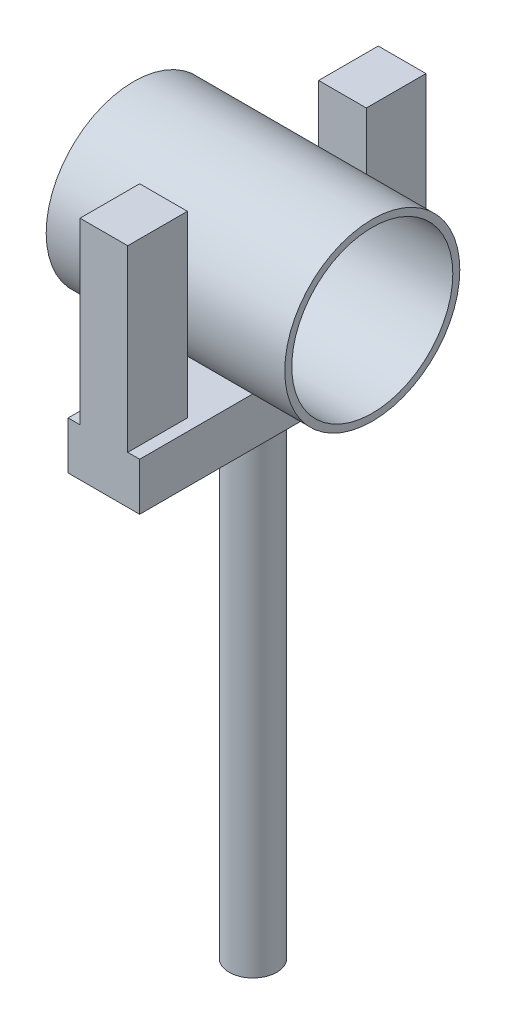
ISO-10303-21;
HEADER;
FILE_DESCRIPTION(('STEP AP214'),'2;1');
FILE_NAME('part.step','',(''),(''),'','','');
FILE_SCHEMA(('AUTOMOTIVE_DESIGN { 1 0 10303 214 1 1 1 1 }'));
ENDSEC;
DATA;
#1=APPLICATION_CONTEXT('core data for automotive mechanical design processes');
#2=APPLICATION_PROTOCOL_DEFINITION('international standard','automotive_design',2000,#1);
#3=PRODUCT_CONTEXT('',#1,'mechanical');
#4=PRODUCT('Part','Part','',(#3));
#5=PRODUCT_RELATED_PRODUCT_CATEGORY('part','',(#4));
#6=PRODUCT_DEFINITION_FORMATION('','',#4);
#7=PRODUCT_DEFINITION_CONTEXT('part definition',#1,'design');
#8=PRODUCT_DEFINITION('design','',#6,#7);
#9=PRODUCT_DEFINITION_SHAPE('','',#8);
#10=(LENGTH_UNIT() NAMED_UNIT(*) SI_UNIT(.MILLI.,.METRE.));
#11=(NAMED_UNIT(*) PLANE_ANGLE_UNIT() SI_UNIT($,.RADIAN.));
#12=(NAMED_UNIT(*) SI_UNIT($,.STERADIAN.) SOLID_ANGLE_UNIT());
#13=UNCERTAINTY_MEASURE_WITH_UNIT(LENGTH_MEASURE(1.E-05),#10,'distance_accuracy_value','');
#14=(GEOMETRIC_REPRESENTATION_CONTEXT(3) GLOBAL_UNCERTAINTY_ASSIGNED_CONTEXT((#13)) GLOBAL_UNIT_ASSIGNED_CONTEXT((#10,
#11,#12)) REPRESENTATION_CONTEXT('',''));
#15=CARTESIAN_POINT('',(0.,0.,0.));
#16=DIRECTION('',(0.,0.,1.));
#17=DIRECTION('',(1.,0.,0.));
#18=AXIS2_PLACEMENT_3D('',#15,#16,#17);
#19=CARTESIAN_POINT('',(-50.,256.687155129039,0.));
#20=DIRECTION('',(1.,0.,0.));
#21=DIRECTION('',(0.,0.,-1.));
#22=AXIS2_PLACEMENT_3D('',#19,#20,#21);
#23=CYLINDRICAL_SURFACE('',#22,36.687155129039);
#24=CARTESIAN_POINT('',(-50.,256.687155129039,0.));
#25=DIRECTION('',(1.,0.,0.));
#26=DIRECTION('',(0.,0.,-1.));
#27=AXIS2_PLACEMENT_3D('',#24,#25,#26);
#28=CIRCLE('',#27,36.687155129039);
#29=CARTESIAN_POINT('',(-50.,256.687155129039,-36.687155129039));
#30=VERTEX_POINT('',#29);
#31=EDGE_CURVE('E11',#30,#30,#28,.T.);
#32=ORIENTED_EDGE('',*,*,#31,.T.);
#33=EDGE_LOOP('',(#32));
#34=FACE_BOUND('',#33,.T.);
#35=CARTESIAN_POINT('',(50.,256.687155129039,0.));
#36=DIRECTION('',(1.,0.,0.));
#37=DIRECTION('',(0.,0.,-1.));
#38=AXIS2_PLACEMENT_3D('',#35,#36,#37);
#39=CIRCLE('',#38,36.687155129039);
#40=CARTESIAN_POINT('',(50.,256.687155129039,-36.687155129039));
#41=VERTEX_POINT('',#40);
#42=EDGE_CURVE('E50',#41,#41,#39,.T.);
#43=ORIENTED_EDGE('',*,*,#42,.F.);
#44=EDGE_LOOP('',(#43));
#45=FACE_BOUND('',#44,.T.);
#46=ADVANCED_FACE('F44',(#34,#45),#23,.T.);
#47=CARTESIAN_POINT('',(-50.,256.687155129039,0.));
#48=DIRECTION('',(1.,0.,0.));
#49=DIRECTION('',(0.,0.,-1.));
#50=AXIS2_PLACEMENT_3D('',#47,#48,#49);
#51=PLANE('',#50);
#52=ORIENTED_EDGE('',*,*,#31,.F.);
#53=EDGE_LOOP('',(#52));
#54=FACE_BOUND('',#53,.T.);
#55=ADVANCED_FACE('F68',(#54),#51,.F.);
#56=CARTESIAN_POINT('',(50.,256.687155129039,0.));
#57=DIRECTION('',(1.,0.,0.));
#58=DIRECTION('',(0.,0.,-1.));
#59=AXIS2_PLACEMENT_3D('',#56,#57,#58);
#60=PLANE('',#59);
#61=CARTESIAN_POINT('',(50.,256.687155129039,0.));
#62=DIRECTION('',(1.,0.,0.));
#63=DIRECTION('',(0.,0.,-1.));
#64=AXIS2_PLACEMENT_3D('',#61,#62,#63);
#65=CIRCLE('',#64,33.75);
#66=CARTESIAN_POINT('',(50.,256.687155129039,-33.75));
#67=VERTEX_POINT('',#66);
#68=EDGE_CURVE('E58',#67,#67,#65,.T.);
#69=ORIENTED_EDGE('',*,*,#68,.F.);
#70=EDGE_LOOP('',(#69));
#71=FACE_BOUND('',#70,.T.);
#72=ORIENTED_EDGE('',*,*,#42,.T.);
#73=EDGE_LOOP('',(#72));
#74=FACE_BOUND('',#73,.T.);
#75=ADVANCED_FACE('F66',(#71,#74),#60,.T.);
#76=CARTESIAN_POINT('',(-45.,256.687155129039,0.));
#77=DIRECTION('',(1.,0.,0.));
#78=DIRECTION('',(0.,0.,-1.));
#79=AXIS2_PLACEMENT_3D('',#76,#77,#78);
#80=CYLINDRICAL_SURFACE('',#79,33.75);
#81=CARTESIAN_POINT('',(-45.,256.687155129039,0.));
#82=DIRECTION('',(1.,0.,0.));
#83=DIRECTION('',(0.,0.,-1.));
#84=AXIS2_PLACEMENT_3D('',#81,#82,#83);
#85=CIRCLE('',#84,33.75);
#86=CARTESIAN_POINT('',(-45.,256.687155129039,-33.75));
#87=VERTEX_POINT('',#86);
#88=EDGE_CURVE('E54',#87,#87,#85,.T.);
#89=ORIENTED_EDGE('',*,*,#88,.F.);
#90=EDGE_LOOP('',(#89));
#91=FACE_BOUND('',#90,.T.);
#92=ORIENTED_EDGE('',*,*,#68,.T.);
#93=EDGE_LOOP('',(#92));
#94=FACE_BOUND('',#93,.T.);
#95=ADVANCED_FACE('F64',(#91,#94),#80,.F.);
#96=CARTESIAN_POINT('',(-45.,256.687155129039,0.));
#97=DIRECTION('',(1.,0.,0.));
#98=DIRECTION('',(0.,0.,-1.));
#99=AXIS2_PLACEMENT_3D('',#96,#97,#98);
#100=PLANE('',#99);
#101=ORIENTED_EDGE('',*,*,#88,.T.);
#102=EDGE_LOOP('',(#101));
#103=FACE_BOUND('',#102,.T.);
#104=ADVANCED_FACE('F74',(#103),#100,.T.);
#105=CLOSED_SHELL('',(#46,#55,#75,#95,#104));
#106=MANIFOLD_SOLID_BREP('B2',#105);
#107=CARTESIAN_POINT('',(-15.,220.,62.5));
#108=DIRECTION('',(0.,1.,0.));
#109=DIRECTION('',(0.,0.,1.));
#110=AXIS2_PLACEMENT_3D('',#107,#108,#109);
#111=PLANE('',#110);
#112=DIRECTION('',(1.,0.,0.));
#113=VECTOR('',#112,1.);
#114=CARTESIAN_POINT('',(-10.,220.,-37.5));
#115=LINE('',#114,#113);
#116=CARTESIAN_POINT('',(-10.,220.,-37.5));
#117=VERTEX_POINT('',#116);
#118=CARTESIAN_POINT('',(10.,220.,-37.5));
#119=VERTEX_POINT('',#118);
#120=EDGE_CURVE('E139',#117,#119,#115,.T.);
#121=ORIENTED_EDGE('',*,*,#120,.F.);
#122=DIRECTION('',(0.,0.,-1.));
#123=VECTOR('',#122,1.);
#124=CARTESIAN_POINT('',(-10.,220.,-62.5));
#125=LINE('',#124,#123);
#126=CARTESIAN_POINT('',(-10.,220.,-62.5));
#127=VERTEX_POINT('',#126);
#128=EDGE_CURVE('E229',#117,#127,#125,.T.);
#129=ORIENTED_EDGE('',*,*,#128,.T.);
#130=DIRECTION('',(1.,0.,0.));
#131=VECTOR('',#130,1.);
#132=CARTESIAN_POINT('',(-15.,220.,-62.5));
#133=LINE('',#132,#131);
#134=CARTESIAN_POINT('',(-15.,220.,-62.5));
#135=VERTEX_POINT('',#134);
#136=EDGE_CURVE('E306',#135,#127,#133,.T.);
#137=ORIENTED_EDGE('',*,*,#136,.F.);
#138=DIRECTION('',(0.,0.,1.));
#139=VECTOR('',#138,1.);
#140=CARTESIAN_POINT('',(-15.,220.,62.5));
#141=LINE('',#140,#139);
#142=CARTESIAN_POINT('',(-15.,220.,62.5));
#143=VERTEX_POINT('',#142);
#144=EDGE_CURVE('E288',#135,#143,#141,.T.);
#145=ORIENTED_EDGE('',*,*,#144,.T.);
#146=DIRECTION('',(1.,0.,0.));
#147=VECTOR('',#146,1.);
#148=CARTESIAN_POINT('',(-15.,220.,62.5));
#149=LINE('',#148,#147);
#150=CARTESIAN_POINT('',(-10.,220.,62.5));
#151=VERTEX_POINT('',#150);
#152=EDGE_CURVE('E302',#143,#151,#149,.T.);
#153=ORIENTED_EDGE('',*,*,#152,.T.);
#154=DIRECTION('',(0.,0.,-1.));
#155=VECTOR('',#154,1.);
#156=CARTESIAN_POINT('',(-10.,220.,62.5));
#157=LINE('',#156,#155);
#158=CARTESIAN_POINT('',(-10.,220.,37.5));
#159=VERTEX_POINT('',#158);
#160=EDGE_CURVE('E257',#151,#159,#157,.T.);
#161=ORIENTED_EDGE('',*,*,#160,.T.);
#162=DIRECTION('',(1.,0.,0.));
#163=VECTOR('',#162,1.);
#164=CARTESIAN_POINT('',(-10.,220.,37.5));
#165=LINE('',#164,#163);
#166=CARTESIAN_POINT('',(10.,220.,37.5));
#167=VERTEX_POINT('',#166);
#168=EDGE_CURVE('E266',#159,#167,#165,.T.);
#169=ORIENTED_EDGE('',*,*,#168,.T.);
#170=DIRECTION('',(0.,0.,-1.));
#171=VECTOR('',#170,1.);
#172=CARTESIAN_POINT('',(10.,220.,62.5));
#173=LINE('',#172,#171);
#174=CARTESIAN_POINT('',(10.,220.,62.5));
#175=VERTEX_POINT('',#174);
#176=EDGE_CURVE('E246',#175,#167,#173,.T.);
#177=ORIENTED_EDGE('',*,*,#176,.F.);
#178=CARTESIAN_POINT('',(15.,220.,62.5));
#179=VERTEX_POINT('',#178);
#180=EDGE_CURVE('E305',#175,#179,#149,.T.);
#181=ORIENTED_EDGE('',*,*,#180,.T.);
#182=DIRECTION('',(0.,0.,1.));
#183=VECTOR('',#182,1.);
#184=CARTESIAN_POINT('',(15.,220.,62.5));
#185=LINE('',#184,#183);
#186=CARTESIAN_POINT('',(15.,220.,-62.5));
#187=VERTEX_POINT('',#186);
#188=EDGE_CURVE('E276',#187,#179,#185,.T.);
#189=ORIENTED_EDGE('',*,*,#188,.F.);
#190=CARTESIAN_POINT('',(10.,220.,-62.5));
#191=VERTEX_POINT('',#190);
#192=EDGE_CURVE('E297',#191,#187,#133,.T.);
#193=ORIENTED_EDGE('',*,*,#192,.F.);
#194=DIRECTION('',(0.,0.,-1.));
#195=VECTOR('',#194,1.);
#196=CARTESIAN_POINT('',(10.,220.,-62.5));
#197=LINE('',#196,#195);
#198=EDGE_CURVE('E144',#119,#191,#197,.T.);
#199=ORIENTED_EDGE('',*,*,#198,.F.);
#200=EDGE_LOOP('',(#121,#129,#137,#145,#153,#161,#169,#177,#181,#189,#193,#199));
#201=FACE_BOUND('',#200,.T.);
#202=ADVANCED_FACE('F124',(#201),#111,.T.);
#203=CARTESIAN_POINT('',(0.,200.,0.));
#204=DIRECTION('',(0.,-1.,0.));
#205=DIRECTION('',(0.,0.,-1.));
#206=AXIS2_PLACEMENT_3D('',#203,#204,#205);
#207=CYLINDRICAL_SURFACE('',#206,10.);
#208=CARTESIAN_POINT('',(0.,200.,0.));
#209=DIRECTION('',(0.,1.,0.));
#210=DIRECTION('',(0.,0.,1.));
#211=AXIS2_PLACEMENT_3D('',#208,#209,#210);
#212=CIRCLE('',#211,10.);
#213=CARTESIAN_POINT('',(0.,200.,10.));
#214=VERTEX_POINT('',#213);
#215=EDGE_CURVE('E42',#214,#214,#212,.T.);
#216=ORIENTED_EDGE('',*,*,#215,.F.);
#217=EDGE_LOOP('',(#216));
#218=FACE_BOUND('',#217,.T.);
#219=CARTESIAN_POINT('',(0.,0.,0.));
#220=DIRECTION('',(0.,1.,0.));
#221=DIRECTION('',(0.,0.,1.));
#222=AXIS2_PLACEMENT_3D('',#219,#220,#221);
#223=CIRCLE('',#222,10.);
#224=CARTESIAN_POINT('',(0.,0.,10.));
#225=VERTEX_POINT('',#224);
#226=EDGE_CURVE('E128',#225,#225,#223,.T.);
#227=ORIENTED_EDGE('',*,*,#226,.T.);
#228=EDGE_LOOP('',(#227));
#229=FACE_BOUND('',#228,.T.);
#230=ADVANCED_FACE('F126',(#218,#229),#207,.T.);
#231=CARTESIAN_POINT('',(0.,0.,0.));
#232=DIRECTION('',(0.,1.,0.));
#233=DIRECTION('',(0.,0.,1.));
#234=AXIS2_PLACEMENT_3D('',#231,#232,#233);
#235=PLANE('',#234);
#236=ORIENTED_EDGE('',*,*,#226,.F.);
#237=EDGE_LOOP('',(#236));
#238=FACE_BOUND('',#237,.T.);
#239=ADVANCED_FACE('F343',(#238),#235,.F.);
#240=CARTESIAN_POINT('',(-15.,220.,-62.5));
#241=DIRECTION('',(0.,0.,-1.));
#242=DIRECTION('',(0.,1.,0.));
#243=AXIS2_PLACEMENT_3D('',#240,#241,#242);
#244=PLANE('',#243);
#245=ORIENTED_EDGE('',*,*,#136,.T.);
#246=DIRECTION('',(0.,1.,0.));
#247=VECTOR('',#246,1.);
#248=CARTESIAN_POINT('',(-10.,220.,-62.5));
#249=LINE('',#248,#247);
#250=CARTESIAN_POINT('',(-10.,295.,-62.5));
#251=VERTEX_POINT('',#250);
#252=EDGE_CURVE('E232',#127,#251,#249,.T.);
#253=ORIENTED_EDGE('',*,*,#252,.T.);
#254=DIRECTION('',(1.,0.,0.));
#255=VECTOR('',#254,1.);
#256=CARTESIAN_POINT('',(-10.,295.,-62.5));
#257=LINE('',#256,#255);
#258=CARTESIAN_POINT('',(10.,295.,-62.5));
#259=VERTEX_POINT('',#258);
#260=EDGE_CURVE('E221',#251,#259,#257,.T.);
#261=ORIENTED_EDGE('',*,*,#260,.T.);
#262=DIRECTION('',(0.,1.,0.));
#263=VECTOR('',#262,1.);
#264=CARTESIAN_POINT('',(10.,220.,-62.5));
#265=LINE('',#264,#263);
#266=EDGE_CURVE('E241',#191,#259,#265,.T.);
#267=ORIENTED_EDGE('',*,*,#266,.F.);
#268=ORIENTED_EDGE('',*,*,#192,.T.);
#269=DIRECTION('',(0.,1.,0.));
#270=VECTOR('',#269,1.);
#271=CARTESIAN_POINT('',(15.,220.,-62.5));
#272=LINE('',#271,#270);
#273=CARTESIAN_POINT('',(15.,200.,-62.5));
#274=VERTEX_POINT('',#273);
#275=EDGE_CURVE('E269',#274,#187,#272,.T.);
#276=ORIENTED_EDGE('',*,*,#275,.F.);
#277=DIRECTION('',(1.,0.,0.));
#278=VECTOR('',#277,1.);
#279=CARTESIAN_POINT('',(-15.,200.,-62.5));
#280=LINE('',#279,#278);
#281=CARTESIAN_POINT('',(-15.,200.,-62.5));
#282=VERTEX_POINT('',#281);
#283=EDGE_CURVE('E298',#282,#274,#280,.T.);
#284=ORIENTED_EDGE('',*,*,#283,.F.);
#285=DIRECTION('',(0.,1.,0.));
#286=VECTOR('',#285,1.);
#287=CARTESIAN_POINT('',(-15.,220.,-62.5));
#288=LINE('',#287,#286);
#289=EDGE_CURVE('E285',#282,#135,#288,.T.);
#290=ORIENTED_EDGE('',*,*,#289,.T.);
#291=EDGE_LOOP('',(#245,#253,#261,#267,#268,#276,#284,#290));
#292=FACE_BOUND('',#291,.T.);
#293=ADVANCED_FACE('F312',(#292),#244,.T.);
#294=CARTESIAN_POINT('',(-15.,200.,62.5));
#295=DIRECTION('',(0.,-1.,0.));
#296=DIRECTION('',(0.,0.,-1.));
#297=AXIS2_PLACEMENT_3D('',#294,#295,#296);
#298=PLANE('',#297);
#299=ORIENTED_EDGE('',*,*,#215,.T.);
#300=EDGE_LOOP('',(#299));
#301=FACE_BOUND('',#300,.T.);
#302=ORIENTED_EDGE('',*,*,#283,.T.);
#303=DIRECTION('',(0.,0.,-1.));
#304=VECTOR('',#303,1.);
#305=CARTESIAN_POINT('',(15.,200.,62.5));
#306=LINE('',#305,#304);
#307=CARTESIAN_POINT('',(15.,200.,62.5));
#308=VERTEX_POINT('',#307);
#309=EDGE_CURVE('E282',#308,#274,#306,.T.);
#310=ORIENTED_EDGE('',*,*,#309,.F.);
#311=DIRECTION('',(1.,0.,0.));
#312=VECTOR('',#311,1.);
#313=CARTESIAN_POINT('',(-15.,200.,62.5));
#314=LINE('',#313,#312);
#315=CARTESIAN_POINT('',(-15.,200.,62.5));
#316=VERTEX_POINT('',#315);
#317=EDGE_CURVE('E300',#316,#308,#314,.T.);
#318=ORIENTED_EDGE('',*,*,#317,.F.);
#319=DIRECTION('',(0.,0.,-1.));
#320=VECTOR('',#319,1.);
#321=CARTESIAN_POINT('',(-15.,200.,62.5));
#322=LINE('',#321,#320);
#323=EDGE_CURVE('E294',#316,#282,#322,.T.);
#324=ORIENTED_EDGE('',*,*,#323,.T.);
#325=EDGE_LOOP('',(#302,#310,#318,#324));
#326=FACE_BOUND('',#325,.T.);
#327=ADVANCED_FACE('F320',(#301,#326),#298,.T.);
#328=CARTESIAN_POINT('',(-15.,220.,62.5));
#329=DIRECTION('',(0.,0.,1.));
#330=DIRECTION('',(1.,0.,0.));
#331=AXIS2_PLACEMENT_3D('',#328,#329,#330);
#332=PLANE('',#331);
#333=ORIENTED_EDGE('',*,*,#317,.T.);
#334=DIRECTION('',(0.,-1.,0.));
#335=VECTOR('',#334,1.);
#336=CARTESIAN_POINT('',(15.,220.,62.5));
#337=LINE('',#336,#335);
#338=EDGE_CURVE('E279',#179,#308,#337,.T.);
#339=ORIENTED_EDGE('',*,*,#338,.F.);
#340=ORIENTED_EDGE('',*,*,#180,.F.);
#341=DIRECTION('',(0.,-1.,0.));
#342=VECTOR('',#341,1.);
#343=CARTESIAN_POINT('',(10.,220.,62.5));
#344=LINE('',#343,#342);
#345=CARTESIAN_POINT('',(10.,295.,62.5));
#346=VERTEX_POINT('',#345);
#347=EDGE_CURVE('E244',#346,#175,#344,.T.);
#348=ORIENTED_EDGE('',*,*,#347,.F.);
#349=DIRECTION('',(1.,0.,0.));
#350=VECTOR('',#349,1.);
#351=CARTESIAN_POINT('',(-10.,295.,62.5));
#352=LINE('',#351,#350);
#353=CARTESIAN_POINT('',(-10.,295.,62.5));
#354=VERTEX_POINT('',#353);
#355=EDGE_CURVE('E267',#354,#346,#352,.T.);
#356=ORIENTED_EDGE('',*,*,#355,.F.);
#357=DIRECTION('',(0.,-1.,0.));
#358=VECTOR('',#357,1.);
#359=CARTESIAN_POINT('',(-10.,220.,62.5));
#360=LINE('',#359,#358);
#361=EDGE_CURVE('E254',#354,#151,#360,.T.);
#362=ORIENTED_EDGE('',*,*,#361,.T.);
#363=ORIENTED_EDGE('',*,*,#152,.F.);
#364=DIRECTION('',(0.,-1.,0.));
#365=VECTOR('',#364,1.);
#366=CARTESIAN_POINT('',(-15.,220.,62.5));
#367=LINE('',#366,#365);
#368=EDGE_CURVE('E291',#143,#316,#367,.T.);
#369=ORIENTED_EDGE('',*,*,#368,.T.);
#370=EDGE_LOOP('',(#333,#339,#340,#348,#356,#362,#363,#369));
#371=FACE_BOUND('',#370,.T.);
#372=ADVANCED_FACE('F347',(#371),#332,.T.);
#373=CARTESIAN_POINT('',(-15.,0.,0.));
#374=DIRECTION('',(1.,0.,0.));
#375=DIRECTION('',(0.,0.,-1.));
#376=AXIS2_PLACEMENT_3D('',#373,#374,#375);
#377=PLANE('',#376);
#378=ORIENTED_EDGE('',*,*,#289,.F.);
#379=ORIENTED_EDGE('',*,*,#323,.F.);
#380=ORIENTED_EDGE('',*,*,#368,.F.);
#381=ORIENTED_EDGE('',*,*,#144,.F.);
#382=EDGE_LOOP('',(#378,#379,#380,#381));
#383=FACE_BOUND('',#382,.T.);
#384=ADVANCED_FACE('F325',(#383),#377,.F.);
#385=CARTESIAN_POINT('',(15.,0.,0.));
#386=DIRECTION('',(1.,0.,0.));
#387=DIRECTION('',(0.,0.,-1.));
#388=AXIS2_PLACEMENT_3D('',#385,#386,#387);
#389=PLANE('',#388);
#390=ORIENTED_EDGE('',*,*,#275,.T.);
#391=ORIENTED_EDGE('',*,*,#188,.T.);
#392=ORIENTED_EDGE('',*,*,#338,.T.);
#393=ORIENTED_EDGE('',*,*,#309,.T.);
#394=EDGE_LOOP('',(#390,#391,#392,#393));
#395=FACE_BOUND('',#394,.T.);
#396=ADVANCED_FACE('F317',(#395),#389,.T.);
#397=CARTESIAN_POINT('',(-10.,295.,62.5));
#398=DIRECTION('',(0.,1.,0.));
#399=DIRECTION('',(0.,0.,1.));
#400=AXIS2_PLACEMENT_3D('',#397,#398,#399);
#401=PLANE('',#400);
#402=ORIENTED_EDGE('',*,*,#355,.T.);
#403=DIRECTION('',(0.,0.,1.));
#404=VECTOR('',#403,1.);
#405=CARTESIAN_POINT('',(10.,295.,62.5));
#406=LINE('',#405,#404);
#407=CARTESIAN_POINT('',(10.,295.,37.5));
#408=VERTEX_POINT('',#407);
#409=EDGE_CURVE('E251',#408,#346,#406,.T.);
#410=ORIENTED_EDGE('',*,*,#409,.F.);
#411=DIRECTION('',(1.,0.,0.));
#412=VECTOR('',#411,1.);
#413=CARTESIAN_POINT('',(-10.,295.,37.5));
#414=LINE('',#413,#412);
#415=CARTESIAN_POINT('',(-10.,295.,37.5));
#416=VERTEX_POINT('',#415);
#417=EDGE_CURVE('E270',#416,#408,#414,.T.);
#418=ORIENTED_EDGE('',*,*,#417,.F.);
#419=DIRECTION('',(0.,0.,1.));
#420=VECTOR('',#419,1.);
#421=CARTESIAN_POINT('',(-10.,295.,62.5));
#422=LINE('',#421,#420);
#423=EDGE_CURVE('E263',#416,#354,#422,.T.);
#424=ORIENTED_EDGE('',*,*,#423,.T.);
#425=EDGE_LOOP('',(#402,#410,#418,#424));
#426=FACE_BOUND('',#425,.T.);
#427=ADVANCED_FACE('F388',(#426),#401,.T.);
#428=CARTESIAN_POINT('',(-10.,220.,37.5));
#429=DIRECTION('',(0.,0.,-1.));
#430=DIRECTION('',(-1.,0.,0.));
#431=AXIS2_PLACEMENT_3D('',#428,#429,#430);
#432=PLANE('',#431);
#433=ORIENTED_EDGE('',*,*,#417,.T.);
#434=DIRECTION('',(0.,1.,0.));
#435=VECTOR('',#434,1.);
#436=CARTESIAN_POINT('',(10.,220.,37.5));
#437=LINE('',#436,#435);
#438=EDGE_CURVE('E248',#167,#408,#437,.T.);
#439=ORIENTED_EDGE('',*,*,#438,.F.);
#440=ORIENTED_EDGE('',*,*,#168,.F.);
#441=DIRECTION('',(0.,1.,0.));
#442=VECTOR('',#441,1.);
#443=CARTESIAN_POINT('',(-10.,220.,37.5));
#444=LINE('',#443,#442);
#445=EDGE_CURVE('E260',#159,#416,#444,.T.);
#446=ORIENTED_EDGE('',*,*,#445,.T.);
#447=EDGE_LOOP('',(#433,#439,#440,#446));
#448=FACE_BOUND('',#447,.T.);
#449=ADVANCED_FACE('F394',(#448),#432,.T.);
#450=CARTESIAN_POINT('',(-10.,0.,0.));
#451=DIRECTION('',(-1.,0.,0.));
#452=DIRECTION('',(0.,0.,1.));
#453=AXIS2_PLACEMENT_3D('',#450,#451,#452);
#454=PLANE('',#453);
#455=ORIENTED_EDGE('',*,*,#361,.F.);
#456=ORIENTED_EDGE('',*,*,#423,.F.);
#457=ORIENTED_EDGE('',*,*,#445,.F.);
#458=ORIENTED_EDGE('',*,*,#160,.F.);
#459=EDGE_LOOP('',(#455,#456,#457,#458));
#460=FACE_BOUND('',#459,.T.);
#461=ADVANCED_FACE('F402',(#460),#454,.T.);
#462=CARTESIAN_POINT('',(10.,0.,0.));
#463=DIRECTION('',(-1.,0.,0.));
#464=DIRECTION('',(0.,0.,1.));
#465=AXIS2_PLACEMENT_3D('',#462,#463,#464);
#466=PLANE('',#465);
#467=ORIENTED_EDGE('',*,*,#347,.T.);
#468=ORIENTED_EDGE('',*,*,#176,.T.);
#469=ORIENTED_EDGE('',*,*,#438,.T.);
#470=ORIENTED_EDGE('',*,*,#409,.T.);
#471=EDGE_LOOP('',(#467,#468,#469,#470));
#472=FACE_BOUND('',#471,.T.);
#473=ADVANCED_FACE('F410',(#472),#466,.F.);
#474=CARTESIAN_POINT('',(-10.,220.,-37.5));
#475=DIRECTION('',(0.,0.,1.));
#476=DIRECTION('',(1.,0.,0.));
#477=AXIS2_PLACEMENT_3D('',#474,#475,#476);
#478=PLANE('',#477);
#479=ORIENTED_EDGE('',*,*,#120,.T.);
#480=DIRECTION('',(0.,-1.,0.));
#481=VECTOR('',#480,1.);
#482=CARTESIAN_POINT('',(10.,220.,-37.5));
#483=LINE('',#482,#481);
#484=CARTESIAN_POINT('',(10.,295.,-37.5));
#485=VERTEX_POINT('',#484);
#486=EDGE_CURVE('E216',#485,#119,#483,.T.);
#487=ORIENTED_EDGE('',*,*,#486,.F.);
#488=DIRECTION('',(1.,0.,0.));
#489=VECTOR('',#488,1.);
#490=CARTESIAN_POINT('',(-10.,295.,-37.5));
#491=LINE('',#490,#489);
#492=CARTESIAN_POINT('',(-10.,295.,-37.5));
#493=VERTEX_POINT('',#492);
#494=EDGE_CURVE('E210',#493,#485,#491,.T.);
#495=ORIENTED_EDGE('',*,*,#494,.F.);
#496=DIRECTION('',(0.,-1.,0.));
#497=VECTOR('',#496,1.);
#498=CARTESIAN_POINT('',(-10.,220.,-37.5));
#499=LINE('',#498,#497);
#500=EDGE_CURVE('E213',#493,#117,#499,.T.);
#501=ORIENTED_EDGE('',*,*,#500,.T.);
#502=EDGE_LOOP('',(#479,#487,#495,#501));
#503=FACE_BOUND('',#502,.T.);
#504=ADVANCED_FACE('F212',(#503),#478,.T.);
#505=CARTESIAN_POINT('',(-10.,295.,-62.5));
#506=DIRECTION('',(0.,1.,0.));
#507=DIRECTION('',(0.,0.,1.));
#508=AXIS2_PLACEMENT_3D('',#505,#506,#507);
#509=PLANE('',#508);
#510=ORIENTED_EDGE('',*,*,#494,.T.);
#511=DIRECTION('',(0.,0.,1.));
#512=VECTOR('',#511,1.);
#513=CARTESIAN_POINT('',(10.,295.,-62.5));
#514=LINE('',#513,#512);
#515=EDGE_CURVE('E239',#259,#485,#514,.T.);
#516=ORIENTED_EDGE('',*,*,#515,.F.);
#517=ORIENTED_EDGE('',*,*,#260,.F.);
#518=DIRECTION('',(0.,0.,1.));
#519=VECTOR('',#518,1.);
#520=CARTESIAN_POINT('',(-10.,295.,-62.5));
#521=LINE('',#520,#519);
#522=EDGE_CURVE('E227',#251,#493,#521,.T.);
#523=ORIENTED_EDGE('',*,*,#522,.T.);
#524=EDGE_LOOP('',(#510,#516,#517,#523));
#525=FACE_BOUND('',#524,.T.);
#526=ADVANCED_FACE('F231',(#525),#509,.T.);
#527=CARTESIAN_POINT('',(-10.,0.,0.));
#528=DIRECTION('',(1.,0.,0.));
#529=DIRECTION('',(0.,0.,-1.));
#530=AXIS2_PLACEMENT_3D('',#527,#528,#529);
#531=PLANE('',#530);
#532=ORIENTED_EDGE('',*,*,#252,.F.);
#533=ORIENTED_EDGE('',*,*,#128,.F.);
#534=ORIENTED_EDGE('',*,*,#500,.F.);
#535=ORIENTED_EDGE('',*,*,#522,.F.);
#536=EDGE_LOOP('',(#532,#533,#534,#535));
#537=FACE_BOUND('',#536,.T.);
#538=ADVANCED_FACE('F226',(#537),#531,.F.);
#539=CARTESIAN_POINT('',(10.,0.,0.));
#540=DIRECTION('',(1.,0.,0.));
#541=DIRECTION('',(0.,0.,-1.));
#542=AXIS2_PLACEMENT_3D('',#539,#540,#541);
#543=PLANE('',#542);
#544=ORIENTED_EDGE('',*,*,#266,.T.);
#545=ORIENTED_EDGE('',*,*,#515,.T.);
#546=ORIENTED_EDGE('',*,*,#486,.T.);
#547=ORIENTED_EDGE('',*,*,#198,.T.);
#548=EDGE_LOOP('',(#544,#545,#546,#547));
#549=FACE_BOUND('',#548,.T.);
#550=ADVANCED_FACE('F330',(#549),#543,.T.);
#551=CLOSED_SHELL('',(#202,#230,#239,#293,#327,#372,#384,#396,#427,#449,#461,#473,#504,#526,
#538,#550));
#552=MANIFOLD_SOLID_BREP('B6',#551);
#553=ADVANCED_BREP_SHAPE_REPRESENTATION('',(#18,#106,#552),#14);
#554=SHAPE_DEFINITION_REPRESENTATION(#9,#553);
ENDSEC;
END-ISO-10303-21;
